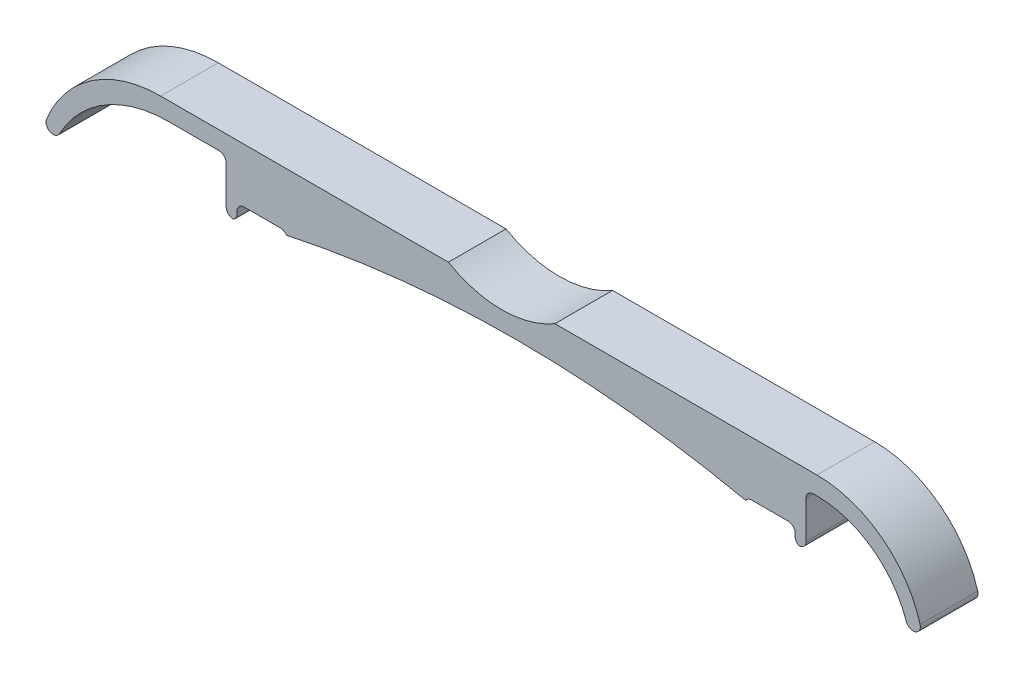
ISO-10303-21;
HEADER;
FILE_DESCRIPTION(('STEP AP214'),'2;1');
FILE_NAME('part.step','',(''),(''),'','','');
FILE_SCHEMA(('AUTOMOTIVE_DESIGN { 1 0 10303 214 1 1 1 1 }'));
ENDSEC;
DATA;
#1=APPLICATION_CONTEXT('core data for automotive mechanical design processes');
#2=APPLICATION_PROTOCOL_DEFINITION('international standard','automotive_design',2000,#1);
#3=PRODUCT_CONTEXT('',#1,'mechanical');
#4=PRODUCT('Part','Part','',(#3));
#5=PRODUCT_RELATED_PRODUCT_CATEGORY('part','',(#4));
#6=PRODUCT_DEFINITION_FORMATION('','',#4);
#7=PRODUCT_DEFINITION_CONTEXT('part definition',#1,'design');
#8=PRODUCT_DEFINITION('design','',#6,#7);
#9=PRODUCT_DEFINITION_SHAPE('','',#8);
#10=(LENGTH_UNIT() NAMED_UNIT(*) SI_UNIT(.MILLI.,.METRE.));
#11=(NAMED_UNIT(*) PLANE_ANGLE_UNIT() SI_UNIT($,.RADIAN.));
#12=(NAMED_UNIT(*) SI_UNIT($,.STERADIAN.) SOLID_ANGLE_UNIT());
#13=UNCERTAINTY_MEASURE_WITH_UNIT(LENGTH_MEASURE(1.E-05),#10,'distance_accuracy_value','');
#14=(GEOMETRIC_REPRESENTATION_CONTEXT(3) GLOBAL_UNCERTAINTY_ASSIGNED_CONTEXT((#13)) GLOBAL_UNIT_ASSIGNED_CONTEXT((#10,
#11,#12)) REPRESENTATION_CONTEXT('',''));
#15=CARTESIAN_POINT('',(0.,0.,0.));
#16=DIRECTION('',(0.,0.,1.));
#17=DIRECTION('',(1.,0.,0.));
#18=AXIS2_PLACEMENT_3D('',#15,#16,#17);
#19=CARTESIAN_POINT('',(34.8072451704714,-1.32210817021467,-8.745));
#20=CARTESIAN_POINT('',(34.8072451704714,-1.32210817021467,-8.48000000000014));
#21=CARTESIAN_POINT('',(34.8072451704711,-1.32210817021364,-8.21499999999981));
#22=CARTESIAN_POINT('',(34.8072451704711,-1.32210817021364,-5.30000000000195));
#23=CARTESIAN_POINT('',(34.8072451704711,-1.32210817021364,-2.64999999999852));
#24=CARTESIAN_POINT('',(34.8072451704711,-1.32210817021364,0.264999999999852));
#25=CARTESIAN_POINT('',(34.8072451704714,-1.32210817021467,0.530000000000103));
#26=CARTESIAN_POINT('',(34.8072451704714,-1.32210817021467,0.794999999999999));
#27=CARTESIAN_POINT('',(35.41903631473,-3.12478184197892,-8.745));
#28=CARTESIAN_POINT('',(35.41903631473,-3.12478184197886,-8.48000000000014));
#29=CARTESIAN_POINT('',(35.4190363147302,-3.12478184198218,-8.21499999999981));
#30=CARTESIAN_POINT('',(35.4190363147302,-3.12478184198155,-5.30000000000195));
#31=CARTESIAN_POINT('',(35.4190363147302,-3.12478184198213,-2.64999999999852));
#32=CARTESIAN_POINT('',(35.4190363147302,-3.12478184198213,0.264999999999852));
#33=CARTESIAN_POINT('',(35.41903631473,-3.12478184197892,0.530000000000103));
#34=CARTESIAN_POINT('',(35.41903631473,-3.12478184197892,0.794999999999999));
#35=CARTESIAN_POINT('',(37.2362025298268,-2.55748322768902,-8.745));
#36=CARTESIAN_POINT('',(37.2362025298268,-2.55748322768896,-8.48000000000015));
#37=CARTESIAN_POINT('',(37.2362025298303,-2.55748322769001,-8.21499999999981));
#38=CARTESIAN_POINT('',(37.2362025298303,-2.55748322768938,-5.30000000000195));
#39=CARTESIAN_POINT('',(37.2362025298303,-2.55748322768995,-2.64999999999852));
#40=CARTESIAN_POINT('',(37.2362025298303,-2.55748322768995,0.264999999999852));
#41=CARTESIAN_POINT('',(37.2362025298268,-2.55748322768902,0.530000000000103));
#42=CARTESIAN_POINT('',(37.2362025298268,-2.55748322768902,0.794999999999999));
#43=CARTESIAN_POINT('',(36.7137392145456,-0.726922424205404,-8.745));
#44=CARTESIAN_POINT('',(36.7137392145456,-0.726922424205404,-8.48000000000014));
#45=CARTESIAN_POINT('',(36.7137392145449,-0.726922424203169,-8.21499999999981));
#46=CARTESIAN_POINT('',(36.7137392145449,-0.726922424203169,-5.30000000000195));
#47=CARTESIAN_POINT('',(36.7137392145449,-0.726922424203169,-2.64999999999852));
#48=CARTESIAN_POINT('',(36.7137392145449,-0.726922424203169,0.264999999999852));
#49=CARTESIAN_POINT('',(36.7137392145456,-0.726922424205404,0.530000000000103));
#50=CARTESIAN_POINT('',(36.7137392145456,-0.726922424205404,0.794999999999999));
#51=(BOUNDED_SURFACE() B_SPLINE_SURFACE(3,3,((#19,#20,#21,#22,#23,#24,#25,#26),(#27,#28,#29,#30,
#31,#32,#33,#34),(#35,#36,#37,#38,#39,#40,#41,#42),(#43,#44,#45,#46,#47,#48,#49,#50)),
.UNSPECIFIED.,.F.,.F.,.F.) B_SPLINE_SURFACE_WITH_KNOTS((4,4),(4,2,2,4),(0.,1.),(-0.1,0.,1.,1.1),
.UNSPECIFIED.) GEOMETRIC_REPRESENTATION_ITEM() RATIONAL_B_SPLINE_SURFACE(((1.,1.,1.,1.,1.,1.,1.,
1.),(0.349719254855024,0.349719254855024,0.349719254854328,0.349719254854328,0.349719254854328,
0.349719254854328,0.349719254855024,0.349719254855024),(0.349719254855024,0.349719254855024,
0.349719254854328,0.349719254854328,0.349719254854328,0.349719254854328,0.349719254855024,
0.349719254855024),(1.,1.,1.,1.,1.,1.,1.,1.))) REPRESENTATION_ITEM('') SURFACE());
#52=CARTESIAN_POINT('',(34.8072451704714,-1.32210817021467,0.794999999999999));
#53=CARTESIAN_POINT('',(34.8072451704714,-1.32210817021467,0.530000000000103));
#54=CARTESIAN_POINT('',(34.8072451704711,-1.32210817021364,0.264999999999852));
#55=CARTESIAN_POINT('',(34.8072451704711,-1.32210817021364,-2.64999999999852));
#56=CARTESIAN_POINT('',(34.8072451704711,-1.32210817021364,-5.30000000000195));
#57=CARTESIAN_POINT('',(34.8072451704711,-1.32210817021364,-8.21499999999981));
#58=CARTESIAN_POINT('',(34.8072451704714,-1.32210817021467,-8.48000000000014));
#59=CARTESIAN_POINT('',(34.8072451704714,-1.32210817021467,-8.745));
#60=(BOUNDED_CURVE() B_SPLINE_CURVE(3,(#52,#53,#54,#55,#56,#57,#58,#59),.UNSPECIFIED.,.F.,
.F.) B_SPLINE_CURVE_WITH_KNOTS((4,2,2,4),(-0.1,0.,1.,1.1),
.UNSPECIFIED.) CURVE() GEOMETRIC_REPRESENTATION_ITEM() RATIONAL_B_SPLINE_CURVE((1.,1.,1.,1.,1.,
1.,1.,1.)) REPRESENTATION_ITEM(''));
#61=CARTESIAN_POINT('',(34.8072451704711,-1.32210817021363,-7.95));
#62=VERTEX_POINT('',#61);
#63=CARTESIAN_POINT('',(34.8072451704711,-1.32210817021363,0.));
#64=VERTEX_POINT('',#63);
#65=EDGE_CURVE('E711',#62,#64,#60,.F.);
#66=CARTESIAN_POINT('',(34.8072451704711,-1.32210817021364,-7.95));
#67=CARTESIAN_POINT('',(35.4190363147302,-3.12478184198213,-7.95));
#68=CARTESIAN_POINT('',(37.2362025298303,-2.55748322768995,-7.95));
#69=CARTESIAN_POINT('',(36.7137392145449,-0.726922424203169,-7.95));
#70=(BOUNDED_CURVE() B_SPLINE_CURVE(3,(#66,#67,#68,#69),.UNSPECIFIED.,.F.,
.F.) B_SPLINE_CURVE_WITH_KNOTS((4,4),(0.,1.),
.UNSPECIFIED.) CURVE() GEOMETRIC_REPRESENTATION_ITEM() RATIONAL_B_SPLINE_CURVE((1.,
0.349719254854328,0.349719254854328,1.)) REPRESENTATION_ITEM(''));
#71=CARTESIAN_POINT('',(36.7137392145449,-0.726922424203171,-7.95));
#72=VERTEX_POINT('',#71);
#73=EDGE_CURVE('E55',#72,#62,#70,.F.);
#74=CARTESIAN_POINT('',(36.7137392145456,-0.726922424205404,-8.745));
#75=CARTESIAN_POINT('',(36.7137392145456,-0.726922424205404,-8.48000000000014));
#76=CARTESIAN_POINT('',(36.7137392145449,-0.726922424203169,-8.21499999999981));
#77=CARTESIAN_POINT('',(36.7137392145449,-0.726922424203169,-5.30000000000195));
#78=CARTESIAN_POINT('',(36.7137392145449,-0.726922424203169,-2.64999999999852));
#79=CARTESIAN_POINT('',(36.7137392145449,-0.726922424203169,0.264999999999852));
#80=CARTESIAN_POINT('',(36.7137392145456,-0.726922424205404,0.530000000000103));
#81=CARTESIAN_POINT('',(36.7137392145456,-0.726922424205404,0.794999999999999));
#82=(BOUNDED_CURVE() B_SPLINE_CURVE(3,(#74,#75,#76,#77,#78,#79,#80,#81),.UNSPECIFIED.,.F.,
.F.) B_SPLINE_CURVE_WITH_KNOTS((4,2,2,4),(-0.1,0.,1.,1.1),
.UNSPECIFIED.) CURVE() GEOMETRIC_REPRESENTATION_ITEM() RATIONAL_B_SPLINE_CURVE((1.,1.,1.,1.,1.,
1.,1.,1.)) REPRESENTATION_ITEM(''));
#83=CARTESIAN_POINT('',(36.7137392145449,-0.726922424203171,0.));
#84=VERTEX_POINT('',#83);
#85=EDGE_CURVE('E714',#84,#72,#82,.F.);
#86=CARTESIAN_POINT('',(36.7137392145449,-0.726922424203169,0.));
#87=CARTESIAN_POINT('',(37.2362025298303,-2.55748322768995,0.));
#88=CARTESIAN_POINT('',(35.4190363147302,-3.12478184198213,0.));
#89=CARTESIAN_POINT('',(34.8072451704711,-1.32210817021364,0.));
#90=(BOUNDED_CURVE() B_SPLINE_CURVE(3,(#86,#87,#88,#89),.UNSPECIFIED.,.F.,
.F.) B_SPLINE_CURVE_WITH_KNOTS((4,4),(0.,1.),
.UNSPECIFIED.) CURVE() GEOMETRIC_REPRESENTATION_ITEM() RATIONAL_B_SPLINE_CURVE((1.,
0.349719254854328,0.349719254854328,1.)) REPRESENTATION_ITEM(''));
#91=EDGE_CURVE('E11',#64,#84,#90,.F.);
#92=ORIENTED_EDGE('',*,*,#65,.F.);
#93=ORIENTED_EDGE('',*,*,#73,.F.);
#94=ORIENTED_EDGE('',*,*,#85,.F.);
#95=ORIENTED_EDGE('',*,*,#91,.F.);
#96=EDGE_LOOP('',(#92,#93,#94,#95));
#97=FACE_BOUND('',#96,.T.);
#98=ADVANCED_FACE('F41',(#97),#51,.T.);
#99=CARTESIAN_POINT('',(-83.7810083665044,-0.643067450817734,-8.745));
#100=CARTESIAN_POINT('',(-83.7810083665044,-0.643067450817734,-8.48000000000014));
#101=CARTESIAN_POINT('',(-83.7810083665044,-0.643067450817712,-8.21499999999981));
#102=CARTESIAN_POINT('',(-83.7810083665044,-0.643067450817712,-5.30000000000195));
#103=CARTESIAN_POINT('',(-83.7810083665044,-0.643067450817712,-2.64999999999852));
#104=CARTESIAN_POINT('',(-83.7810083665044,-0.643067450817712,0.264999999999852));
#105=CARTESIAN_POINT('',(-83.7810083665044,-0.643067450817734,0.530000000000103));
#106=CARTESIAN_POINT('',(-83.7810083665044,-0.643067450817734,0.794999999999999));
#107=CARTESIAN_POINT('',(-84.4430526963775,-2.29430865799575,-8.745));
#108=CARTESIAN_POINT('',(-84.4430526963775,-2.29430865799575,-8.48000000000014));
#109=CARTESIAN_POINT('',(-84.4430526963775,-2.29430865799576,-8.21499999999981));
#110=CARTESIAN_POINT('',(-84.4430526963775,-2.29430865799576,-5.30000000000195));
#111=CARTESIAN_POINT('',(-84.4430526963775,-2.29430865799576,-2.64999999999852));
#112=CARTESIAN_POINT('',(-84.4430526963775,-2.29430865799576,0.264999999999852));
#113=CARTESIAN_POINT('',(-84.4430526963775,-2.29430865799575,0.530000000000103));
#114=CARTESIAN_POINT('',(-84.4430526963775,-2.29430865799575,0.794999999999999));
#115=CARTESIAN_POINT('',(-82.8307501980664,-3.04622678714264,-8.745));
#116=CARTESIAN_POINT('',(-82.8307501980664,-3.04622678714264,-8.48000000000014));
#117=CARTESIAN_POINT('',(-82.8307501980664,-3.04622678714268,-8.21499999999981));
#118=CARTESIAN_POINT('',(-82.8307501980664,-3.04622678714268,-5.30000000000195));
#119=CARTESIAN_POINT('',(-82.8307501980664,-3.04622678714268,-2.64999999999852));
#120=CARTESIAN_POINT('',(-82.8307501980664,-3.04622678714268,0.264999999999852));
#121=CARTESIAN_POINT('',(-82.8307501980664,-3.04622678714264,0.530000000000103));
#122=CARTESIAN_POINT('',(-82.8307501980664,-3.04622678714264,0.794999999999999));
#123=CARTESIAN_POINT('',(-81.9912375022438,-1.47775024841069,-8.745));
#124=CARTESIAN_POINT('',(-81.9912375022438,-1.47775024841069,-8.48000000000014));
#125=CARTESIAN_POINT('',(-81.9912375022438,-1.47775024841068,-8.21499999999981));
#126=CARTESIAN_POINT('',(-81.9912375022438,-1.47775024841068,-5.30000000000195));
#127=CARTESIAN_POINT('',(-81.9912375022438,-1.47775024841068,-2.64999999999852));
#128=CARTESIAN_POINT('',(-81.9912375022438,-1.47775024841068,0.264999999999852));
#129=CARTESIAN_POINT('',(-81.9912375022438,-1.47775024841069,0.530000000000103));
#130=CARTESIAN_POINT('',(-81.9912375022438,-1.47775024841069,0.794999999999999));
#131=(BOUNDED_SURFACE() B_SPLINE_SURFACE(3,3,((#99,#100,#101,#102,#103,#104,#105,#106),(#107,
#108,#109,#110,#111,#112,#113,#114),(#115,#116,#117,#118,#119,#120,#121,#122),(#123,#124,#125,
#126,#127,#128,#129,#130)),.UNSPECIFIED.,.F.,.F.,.F.) B_SPLINE_SURFACE_WITH_KNOTS((4,4),(4,2,2,
4),(0.,1.),(-0.1,0.,1.,1.1),
.UNSPECIFIED.) GEOMETRIC_REPRESENTATION_ITEM() RATIONAL_B_SPLINE_SURFACE(((1.,1.,1.,1.,1.,1.,1.,
1.),(0.37002379436352,0.37002379436352,0.370023794363511,0.370023794363511,0.370023794363511,
0.370023794363511,0.37002379436352,0.37002379436352),(0.37002379436352,0.37002379436352,
0.370023794363511,0.370023794363511,0.370023794363511,0.370023794363511,0.37002379436352,
0.37002379436352),(1.,1.,1.,1.,1.,1.,1.,1.))) REPRESENTATION_ITEM('') SURFACE());
#132=CARTESIAN_POINT('',(-81.9912375022438,-1.47775024841069,-8.745));
#133=CARTESIAN_POINT('',(-81.9912375022438,-1.47775024841069,-8.48000000000014));
#134=CARTESIAN_POINT('',(-81.9912375022438,-1.47775024841068,-8.21499999999981));
#135=CARTESIAN_POINT('',(-81.9912375022438,-1.47775024841068,-5.30000000000195));
#136=CARTESIAN_POINT('',(-81.9912375022438,-1.47775024841068,-2.64999999999852));
#137=CARTESIAN_POINT('',(-81.9912375022438,-1.47775024841068,0.264999999999852));
#138=CARTESIAN_POINT('',(-81.9912375022438,-1.47775024841069,0.530000000000103));
#139=CARTESIAN_POINT('',(-81.9912375022438,-1.47775024841069,0.794999999999999));
#140=(BOUNDED_CURVE() B_SPLINE_CURVE(3,(#132,#133,#134,#135,#136,#137,#138,#139),.UNSPECIFIED.,
.F.,.F.) B_SPLINE_CURVE_WITH_KNOTS((4,2,2,4),(-0.1,0.,1.,1.1),
.UNSPECIFIED.) CURVE() GEOMETRIC_REPRESENTATION_ITEM() RATIONAL_B_SPLINE_CURVE((1.,1.,1.,1.,1.,
1.,1.,1.)) REPRESENTATION_ITEM(''));
#141=CARTESIAN_POINT('',(-81.9912375022438,-1.47775024841068,0.));
#142=VERTEX_POINT('',#141);
#143=CARTESIAN_POINT('',(-81.9912375022438,-1.47775024841068,-7.95));
#144=VERTEX_POINT('',#143);
#145=EDGE_CURVE('E351',#142,#144,#140,.F.);
#146=CARTESIAN_POINT('',(-81.9912375022438,-1.47775024841068,0.));
#147=CARTESIAN_POINT('',(-82.8307501980664,-3.04622678714268,0.));
#148=CARTESIAN_POINT('',(-84.4430526963775,-2.29430865799576,0.));
#149=CARTESIAN_POINT('',(-83.7810083665044,-0.643067450817712,0.));
#150=(BOUNDED_CURVE() B_SPLINE_CURVE(3,(#146,#147,#148,#149),.UNSPECIFIED.,.F.,
.F.) B_SPLINE_CURVE_WITH_KNOTS((4,4),(0.,1.),
.UNSPECIFIED.) CURVE() GEOMETRIC_REPRESENTATION_ITEM() RATIONAL_B_SPLINE_CURVE((1.,
0.370023794363511,0.370023794363511,1.)) REPRESENTATION_ITEM(''));
#151=CARTESIAN_POINT('',(-83.7810083665044,-0.643067450817717,0.));
#152=VERTEX_POINT('',#151);
#153=EDGE_CURVE('E717',#152,#142,#150,.F.);
#154=CARTESIAN_POINT('',(-83.7810083665044,-0.643067450817734,0.794999999999999));
#155=CARTESIAN_POINT('',(-83.7810083665044,-0.643067450817734,0.530000000000103));
#156=CARTESIAN_POINT('',(-83.7810083665044,-0.643067450817712,0.264999999999852));
#157=CARTESIAN_POINT('',(-83.7810083665044,-0.643067450817712,-2.64999999999852));
#158=CARTESIAN_POINT('',(-83.7810083665044,-0.643067450817712,-5.30000000000195));
#159=CARTESIAN_POINT('',(-83.7810083665044,-0.643067450817712,-8.21499999999981));
#160=CARTESIAN_POINT('',(-83.7810083665044,-0.643067450817734,-8.48000000000014));
#161=CARTESIAN_POINT('',(-83.7810083665044,-0.643067450817734,-8.745));
#162=(BOUNDED_CURVE() B_SPLINE_CURVE(3,(#154,#155,#156,#157,#158,#159,#160,#161),.UNSPECIFIED.,
.F.,.F.) B_SPLINE_CURVE_WITH_KNOTS((4,2,2,4),(-0.1,0.,1.,1.1),
.UNSPECIFIED.) CURVE() GEOMETRIC_REPRESENTATION_ITEM() RATIONAL_B_SPLINE_CURVE((1.,1.,1.,1.,1.,
1.,1.,1.)) REPRESENTATION_ITEM(''));
#163=CARTESIAN_POINT('',(-83.7810083665044,-0.64306745081771,-7.95));
#164=VERTEX_POINT('',#163);
#165=EDGE_CURVE('E273',#164,#152,#162,.F.);
#166=CARTESIAN_POINT('',(-83.7810083665044,-0.643067450817712,-7.95));
#167=CARTESIAN_POINT('',(-84.4430526963775,-2.29430865799576,-7.95));
#168=CARTESIAN_POINT('',(-82.8307501980664,-3.04622678714268,-7.95));
#169=CARTESIAN_POINT('',(-81.9912375022438,-1.47775024841068,-7.95));
#170=(BOUNDED_CURVE() B_SPLINE_CURVE(3,(#166,#167,#168,#169),.UNSPECIFIED.,.F.,
.F.) B_SPLINE_CURVE_WITH_KNOTS((4,4),(0.,1.),
.UNSPECIFIED.) CURVE() GEOMETRIC_REPRESENTATION_ITEM() RATIONAL_B_SPLINE_CURVE((1.,
0.370023794363511,0.370023794363511,1.)) REPRESENTATION_ITEM(''));
#171=EDGE_CURVE('E393',#144,#164,#170,.F.);
#172=ORIENTED_EDGE('',*,*,#145,.F.);
#173=ORIENTED_EDGE('',*,*,#153,.F.);
#174=ORIENTED_EDGE('',*,*,#165,.F.);
#175=ORIENTED_EDGE('',*,*,#171,.F.);
#176=EDGE_LOOP('',(#172,#173,#174,#175));
#177=FACE_BOUND('',#176,.T.);
#178=ADVANCED_FACE('F358',(#177),#131,.T.);
#179=CARTESIAN_POINT('',(-68.0471613175873,9.99999999999999,-7.95));
#180=DIRECTION('',(0.,1.,0.));
#181=DIRECTION('',(0.,0.,1.));
#182=AXIS2_PLACEMENT_3D('',#179,#180,#181);
#183=PLANE('',#182);
#184=DIRECTION('',(0.,0.,1.));
#185=VECTOR('',#184,1.);
#186=CARTESIAN_POINT('',(-28.3484692283495,9.99999999999998,-7.95));
#187=LINE('',#186,#185);
#188=CARTESIAN_POINT('',(-28.3484692283495,9.99999999999998,-7.95));
#189=VERTEX_POINT('',#188);
#190=CARTESIAN_POINT('',(-28.3484692283495,9.99999999999999,0.));
#191=VERTEX_POINT('',#190);
#192=EDGE_CURVE('E230',#189,#191,#187,.T.);
#193=ORIENTED_EDGE('',*,*,#192,.F.);
#194=DIRECTION('',(-1.,0.,0.));
#195=VECTOR('',#194,1.);
#196=CARTESIAN_POINT('',(0.,9.99999999999999,-7.95));
#197=LINE('',#196,#195);
#198=CARTESIAN_POINT('',(-68.0471613175873,9.99999999999998,-7.95));
#199=VERTEX_POINT('',#198);
#200=EDGE_CURVE('E239',#189,#199,#197,.T.);
#201=ORIENTED_EDGE('',*,*,#200,.T.);
#202=DIRECTION('',(0.,0.,1.));
#203=VECTOR('',#202,1.);
#204=CARTESIAN_POINT('',(-68.0471613175873,9.99999999999998,-7.95));
#205=LINE('',#204,#203);
#206=CARTESIAN_POINT('',(-68.0471613175873,9.99999999999998,0.));
#207=VERTEX_POINT('',#206);
#208=EDGE_CURVE('E545',#199,#207,#205,.T.);
#209=ORIENTED_EDGE('',*,*,#208,.T.);
#210=DIRECTION('',(-1.,0.,0.));
#211=VECTOR('',#210,1.);
#212=CARTESIAN_POINT('',(-68.0471613175873,9.99999999999999,0.));
#213=LINE('',#212,#211);
#214=EDGE_CURVE('E420',#191,#207,#213,.T.);
#215=ORIENTED_EDGE('',*,*,#214,.F.);
#216=EDGE_LOOP('',(#193,#201,#209,#215));
#217=FACE_BOUND('',#216,.T.);
#218=ADVANCED_FACE('F296',(#217),#183,.T.);
#219=CARTESIAN_POINT('',(-19.0031252487569,-144.56832294801,-7.95));
#220=DIRECTION('',(0.,0.,1.));
#221=DIRECTION('',(1.,0.,0.));
#222=AXIS2_PLACEMENT_3D('',#219,#220,#221);
#223=CYLINDRICAL_SURFACE('',#222,150.);
#224=DIRECTION('',(0.,0.,1.));
#225=VECTOR('',#224,1.);
#226=CARTESIAN_POINT('',(-50.6687591272683,2.05121064513673,-3.975));
#227=LINE('',#226,#225);
#228=CARTESIAN_POINT('',(-50.6687591272683,2.05121064513673,-7.95));
#229=VERTEX_POINT('',#228);
#230=CARTESIAN_POINT('',(-50.668759127266,2.05121064513827,0.));
#231=VERTEX_POINT('',#230);
#232=EDGE_CURVE('E446',#229,#231,#227,.T.);
#233=ORIENTED_EDGE('',*,*,#232,.F.);
#234=CARTESIAN_POINT('',(-19.0031252487569,-144.56832294801,-7.95));
#235=DIRECTION('',(0.,0.,-1.));
#236=DIRECTION('',(-1.,0.,0.));
#237=AXIS2_PLACEMENT_3D('',#234,#235,#236);
#238=CIRCLE('',#237,150.);
#239=CARTESIAN_POINT('',(12.6625086297545,2.05121064513673,-7.95));
#240=VERTEX_POINT('',#239);
#241=EDGE_CURVE('E438',#229,#240,#238,.T.);
#242=ORIENTED_EDGE('',*,*,#241,.T.);
#243=DIRECTION('',(0.,0.,1.));
#244=VECTOR('',#243,1.);
#245=CARTESIAN_POINT('',(12.6625086297545,2.05121064513673,-3.975));
#246=LINE('',#245,#244);
#247=CARTESIAN_POINT('',(12.6625086297545,2.05121064513673,0.));
#248=VERTEX_POINT('',#247);
#249=EDGE_CURVE('E450',#248,#240,#246,.F.);
#250=ORIENTED_EDGE('',*,*,#249,.F.);
#251=CARTESIAN_POINT('',(-19.0031252487569,-144.56832294801,0.));
#252=DIRECTION('',(0.,0.,-1.));
#253=DIRECTION('',(-1.,0.,0.));
#254=AXIS2_PLACEMENT_3D('',#251,#252,#253);
#255=CIRCLE('',#254,150.);
#256=EDGE_CURVE('E449',#231,#248,#255,.T.);
#257=ORIENTED_EDGE('',*,*,#256,.F.);
#258=EDGE_LOOP('',(#233,#242,#250,#257));
#259=FACE_BOUND('',#258,.T.);
#260=ADVANCED_FACE('F679',(#259),#223,.F.);
#261=CARTESIAN_POINT('',(-59.0031252487569,0.,-7.95));
#262=DIRECTION('',(-1.,0.,0.));
#263=DIRECTION('',(0.,0.,1.));
#264=AXIS2_PLACEMENT_3D('',#261,#262,#263);
#265=PLANE('',#264);
#266=DIRECTION('',(0.,-1.,0.));
#267=VECTOR('',#266,1.);
#268=CARTESIAN_POINT('',(-59.0031252487569,0.,-7.95));
#269=LINE('',#268,#267);
#270=CARTESIAN_POINT('',(-59.0031252487569,6.49999999999998,-7.95));
#271=VERTEX_POINT('',#270);
#272=CARTESIAN_POINT('',(-59.0031252487569,1.30833728247415,-7.95));
#273=VERTEX_POINT('',#272);
#274=EDGE_CURVE('E554',#271,#273,#269,.T.);
#275=ORIENTED_EDGE('',*,*,#274,.T.);
#276=DIRECTION('',(0.,0.,1.));
#277=VECTOR('',#276,1.);
#278=CARTESIAN_POINT('',(-59.0031252487569,1.30833728247415,-7.95));
#279=LINE('',#278,#277);
#280=CARTESIAN_POINT('',(-59.0031252487569,1.30833728247415,0.));
#281=VERTEX_POINT('',#280);
#282=EDGE_CURVE('E607',#273,#281,#279,.T.);
#283=ORIENTED_EDGE('',*,*,#282,.T.);
#284=DIRECTION('',(0.,-1.,0.));
#285=VECTOR('',#284,1.);
#286=CARTESIAN_POINT('',(-59.0031252487569,0.,0.));
#287=LINE('',#286,#285);
#288=CARTESIAN_POINT('',(-59.0031252487569,6.49999999999998,0.));
#289=VERTEX_POINT('',#288);
#290=EDGE_CURVE('E445',#289,#281,#287,.T.);
#291=ORIENTED_EDGE('',*,*,#290,.F.);
#292=DIRECTION('',(0.,0.,1.));
#293=VECTOR('',#292,1.);
#294=CARTESIAN_POINT('',(-59.0031252487569,6.49999999999998,-7.95));
#295=LINE('',#294,#293);
#296=EDGE_CURVE('E604',#289,#271,#295,.F.);
#297=ORIENTED_EDGE('',*,*,#296,.T.);
#298=EDGE_LOOP('',(#275,#283,#291,#297));
#299=FACE_BOUND('',#298,.T.);
#300=ADVANCED_FACE('F654',(#299),#265,.T.);
#301=CARTESIAN_POINT('',(-59.0031252487569,7.49999999999998,-7.95));
#302=DIRECTION('',(0.,-1.,0.));
#303=DIRECTION('',(1.,0.,0.));
#304=AXIS2_PLACEMENT_3D('',#301,#302,#303);
#305=PLANE('',#304);
#306=DIRECTION('',(1.,0.,0.));
#307=VECTOR('',#306,1.);
#308=CARTESIAN_POINT('',(-59.0031252487569,7.49999999999998,-7.95));
#309=LINE('',#308,#307);
#310=CARTESIAN_POINT('',(-67.0031252487569,7.49999999999998,-7.95));
#311=VERTEX_POINT('',#310);
#312=CARTESIAN_POINT('',(-60.0031252487569,7.49999999999998,-7.95));
#313=VERTEX_POINT('',#312);
#314=EDGE_CURVE('E630',#311,#313,#309,.T.);
#315=ORIENTED_EDGE('',*,*,#314,.T.);
#316=DIRECTION('',(0.,0.,1.));
#317=VECTOR('',#316,1.);
#318=CARTESIAN_POINT('',(-60.0031252487569,7.49999999999998,0.));
#319=LINE('',#318,#317);
#320=CARTESIAN_POINT('',(-60.0031252487569,7.49999999999998,0.));
#321=VERTEX_POINT('',#320);
#322=EDGE_CURVE('E610',#313,#321,#319,.T.);
#323=ORIENTED_EDGE('',*,*,#322,.T.);
#324=DIRECTION('',(1.,0.,0.));
#325=VECTOR('',#324,1.);
#326=CARTESIAN_POINT('',(-59.0031252487569,7.49999999999998,0.));
#327=LINE('',#326,#325);
#328=CARTESIAN_POINT('',(-67.0031252487569,7.49999999999998,0.));
#329=VERTEX_POINT('',#328);
#330=EDGE_CURVE('E529',#329,#321,#327,.T.);
#331=ORIENTED_EDGE('',*,*,#330,.F.);
#332=DIRECTION('',(0.,0.,1.));
#333=VECTOR('',#332,1.);
#334=CARTESIAN_POINT('',(-67.0031252487569,7.49999999999998,-7.95));
#335=LINE('',#334,#333);
#336=EDGE_CURVE('E540',#311,#329,#335,.T.);
#337=ORIENTED_EDGE('',*,*,#336,.F.);
#338=EDGE_LOOP('',(#315,#323,#331,#337));
#339=FACE_BOUND('',#338,.T.);
#340=ADVANCED_FACE('F787',(#339),#305,.T.);
#341=CARTESIAN_POINT('',(-67.0031252487569,-9.50000000000002,-7.95));
#342=DIRECTION('',(0.,0.,1.));
#343=DIRECTION('',(1.,0.,0.));
#344=AXIS2_PLACEMENT_3D('',#341,#342,#343);
#345=CYLINDRICAL_SURFACE('',#344,17.);
#346=CARTESIAN_POINT('',(-67.0031252487569,-9.50000000000002,0.));
#347=DIRECTION('',(0.,0.,-1.));
#348=DIRECTION('',(1.,0.,0.));
#349=AXIS2_PLACEMENT_3D('',#346,#347,#348);
#350=CIRCLE('',#349,17.);
#351=EDGE_CURVE('E527',#142,#329,#350,.T.);
#352=ORIENTED_EDGE('',*,*,#351,.F.);
#353=ORIENTED_EDGE('',*,*,#145,.T.);
#354=CARTESIAN_POINT('',(-67.0031252487569,-9.50000000000002,-7.95));
#355=DIRECTION('',(0.,0.,-1.));
#356=DIRECTION('',(1.,0.,0.));
#357=AXIS2_PLACEMENT_3D('',#354,#355,#356);
#358=CIRCLE('',#357,17.);
#359=EDGE_CURVE('E252',#144,#311,#358,.T.);
#360=ORIENTED_EDGE('',*,*,#359,.T.);
#361=ORIENTED_EDGE('',*,*,#336,.T.);
#362=EDGE_LOOP('',(#352,#353,#360,#361));
#363=FACE_BOUND('',#362,.T.);
#364=ADVANCED_FACE('F290',(#363),#345,.F.);
#365=CARTESIAN_POINT('',(-68.0471613175873,-6.95135492604854,-7.95));
#366=DIRECTION('',(0.,0.,1.));
#367=DIRECTION('',(1.,0.,0.));
#368=AXIS2_PLACEMENT_3D('',#365,#366,#367);
#369=CYLINDRICAL_SURFACE('',#368,16.9513549260485);
#370=CARTESIAN_POINT('',(-68.0471613175873,-6.95135492604854,-7.95));
#371=DIRECTION('',(0.,0.,1.));
#372=DIRECTION('',(1.,0.,0.));
#373=AXIS2_PLACEMENT_3D('',#370,#371,#372);
#374=CIRCLE('',#373,16.9513549260485);
#375=EDGE_CURVE('E247',#199,#164,#374,.T.);
#376=ORIENTED_EDGE('',*,*,#375,.T.);
#377=ORIENTED_EDGE('',*,*,#165,.T.);
#378=CARTESIAN_POINT('',(-68.0471613175873,-6.95135492604854,0.));
#379=DIRECTION('',(0.,0.,1.));
#380=DIRECTION('',(1.,0.,0.));
#381=AXIS2_PLACEMENT_3D('',#378,#379,#380);
#382=CIRCLE('',#381,16.9513549260485);
#383=EDGE_CURVE('E265',#207,#152,#382,.T.);
#384=ORIENTED_EDGE('',*,*,#383,.F.);
#385=ORIENTED_EDGE('',*,*,#208,.F.);
#386=EDGE_LOOP('',(#376,#377,#384,#385));
#387=FACE_BOUND('',#386,.T.);
#388=ADVANCED_FACE('F280',(#387),#369,.T.);
#389=DIRECTION('',(0.,0.,1.));
#390=VECTOR('',#389,1.);
#391=CARTESIAN_POINT('',(-13.6515307716505,9.99999999999998,-7.95));
#392=LINE('',#391,#390);
#393=CARTESIAN_POINT('',(-13.6515307716505,9.99999999999998,-7.95));
#394=VERTEX_POINT('',#393);
#395=CARTESIAN_POINT('',(-13.6515307716505,9.99999999999998,0.));
#396=VERTEX_POINT('',#395);
#397=EDGE_CURVE('E218',#394,#396,#392,.T.);
#398=ORIENTED_EDGE('',*,*,#397,.T.);
#399=CARTESIAN_POINT('',(22.4968747512431,9.99999999999998,0.));
#400=VERTEX_POINT('',#399);
#401=EDGE_CURVE('E416',#400,#396,#213,.T.);
#402=ORIENTED_EDGE('',*,*,#401,.F.);
#403=DIRECTION('',(0.,0.,1.));
#404=VECTOR('',#403,1.);
#405=CARTESIAN_POINT('',(22.4968747512431,9.99999999999998,-7.95));
#406=LINE('',#405,#404);
#407=CARTESIAN_POINT('',(22.4968747512431,9.99999999999998,-7.95));
#408=VERTEX_POINT('',#407);
#409=EDGE_CURVE('E245',#408,#400,#406,.T.);
#410=ORIENTED_EDGE('',*,*,#409,.F.);
#411=EDGE_CURVE('E237',#408,#394,#197,.T.);
#412=ORIENTED_EDGE('',*,*,#411,.T.);
#413=EDGE_LOOP('',(#398,#402,#410,#412));
#414=FACE_BOUND('',#413,.T.);
#415=ADVANCED_FACE('F243',(#414),#183,.T.);
#416=CARTESIAN_POINT('',(22.4968747512431,-4.78458067092485,-7.95));
#417=DIRECTION('',(0.,0.,1.));
#418=DIRECTION('',(1.,0.,0.));
#419=AXIS2_PLACEMENT_3D('',#416,#417,#418);
#420=CYLINDRICAL_SURFACE('',#419,14.7845806709248);
#421=CARTESIAN_POINT('',(22.4968747512431,-4.78458067092485,0.));
#422=DIRECTION('',(0.,0.,1.));
#423=DIRECTION('',(-1.,0.,0.));
#424=AXIS2_PLACEMENT_3D('',#421,#422,#423);
#425=CIRCLE('',#424,14.7845806709248);
#426=EDGE_CURVE('E406',#84,#400,#425,.T.);
#427=ORIENTED_EDGE('',*,*,#426,.F.);
#428=ORIENTED_EDGE('',*,*,#85,.T.);
#429=CARTESIAN_POINT('',(22.4968747512431,-4.78458067092485,-7.95));
#430=DIRECTION('',(0.,0.,1.));
#431=DIRECTION('',(-1.,0.,0.));
#432=AXIS2_PLACEMENT_3D('',#429,#430,#431);
#433=CIRCLE('',#432,14.7845806709248);
#434=EDGE_CURVE('E254',#72,#408,#433,.T.);
#435=ORIENTED_EDGE('',*,*,#434,.T.);
#436=ORIENTED_EDGE('',*,*,#409,.T.);
#437=EDGE_LOOP('',(#427,#428,#435,#436));
#438=FACE_BOUND('',#437,.T.);
#439=ADVANCED_FACE('F295',(#438),#420,.T.);
#440=CARTESIAN_POINT('',(22.4968747512431,-5.50000000000001,-7.95));
#441=DIRECTION('',(0.,0.,1.));
#442=DIRECTION('',(1.,0.,0.));
#443=AXIS2_PLACEMENT_3D('',#440,#441,#442);
#444=CYLINDRICAL_SURFACE('',#443,13.);
#445=CARTESIAN_POINT('',(22.4968747512431,-5.50000000000001,-7.95));
#446=DIRECTION('',(0.,0.,-1.));
#447=DIRECTION('',(-1.,0.,0.));
#448=AXIS2_PLACEMENT_3D('',#445,#446,#447);
#449=CIRCLE('',#448,13.);
#450=CARTESIAN_POINT('',(22.4968747512431,7.49999999999999,-7.95));
#451=VERTEX_POINT('',#450);
#452=EDGE_CURVE('E408',#451,#62,#449,.T.);
#453=ORIENTED_EDGE('',*,*,#452,.T.);
#454=ORIENTED_EDGE('',*,*,#65,.T.);
#455=CARTESIAN_POINT('',(22.4968747512431,-5.50000000000001,0.));
#456=DIRECTION('',(0.,0.,-1.));
#457=DIRECTION('',(-1.,0.,0.));
#458=AXIS2_PLACEMENT_3D('',#455,#456,#457);
#459=CIRCLE('',#458,13.);
#460=CARTESIAN_POINT('',(22.4968747512431,7.49999999999999,0.));
#461=VERTEX_POINT('',#460);
#462=EDGE_CURVE('E397',#461,#64,#459,.T.);
#463=ORIENTED_EDGE('',*,*,#462,.F.);
#464=DIRECTION('',(0.,0.,1.));
#465=VECTOR('',#464,1.);
#466=CARTESIAN_POINT('',(22.4968747512431,7.49999999999999,-7.95));
#467=LINE('',#466,#465);
#468=EDGE_CURVE('E551',#451,#461,#467,.T.);
#469=ORIENTED_EDGE('',*,*,#468,.F.);
#470=EDGE_LOOP('',(#453,#454,#463,#469));
#471=FACE_BOUND('',#470,.T.);
#472=ADVANCED_FACE('F300',(#471),#444,.F.);
#473=CARTESIAN_POINT('',(22.4968747512431,7.49999999999999,-7.95));
#474=DIRECTION('',(0.,-1.,0.));
#475=DIRECTION('',(0.,0.,-1.));
#476=AXIS2_PLACEMENT_3D('',#473,#474,#475);
#477=PLANE('',#476);
#478=DIRECTION('',(1.,0.,0.));
#479=VECTOR('',#478,1.);
#480=CARTESIAN_POINT('',(22.4968747512431,7.49999999999999,0.));
#481=LINE('',#480,#479);
#482=CARTESIAN_POINT('',(21.9968747512431,7.49999999999999,0.));
#483=VERTEX_POINT('',#482);
#484=EDGE_CURVE('E407',#483,#461,#481,.T.);
#485=ORIENTED_EDGE('',*,*,#484,.F.);
#486=DIRECTION('',(0.,0.,1.));
#487=VECTOR('',#486,1.);
#488=CARTESIAN_POINT('',(21.9968747512431,7.49999999999999,-7.95));
#489=LINE('',#488,#487);
#490=CARTESIAN_POINT('',(21.9968747512431,7.49999999999999,-7.95));
#491=VERTEX_POINT('',#490);
#492=EDGE_CURVE('E601',#483,#491,#489,.F.);
#493=ORIENTED_EDGE('',*,*,#492,.T.);
#494=DIRECTION('',(1.,0.,0.));
#495=VECTOR('',#494,1.);
#496=CARTESIAN_POINT('',(22.4968747512431,7.49999999999999,-7.95));
#497=LINE('',#496,#495);
#498=EDGE_CURVE('E426',#491,#451,#497,.T.);
#499=ORIENTED_EDGE('',*,*,#498,.T.);
#500=ORIENTED_EDGE('',*,*,#468,.T.);
#501=EDGE_LOOP('',(#485,#493,#499,#500));
#502=FACE_BOUND('',#501,.T.);
#503=ADVANCED_FACE('F709',(#502),#477,.T.);
#504=CARTESIAN_POINT('',(20.9968747512431,0.,-7.95));
#505=DIRECTION('',(1.,0.,0.));
#506=DIRECTION('',(0.,1.,0.));
#507=AXIS2_PLACEMENT_3D('',#504,#505,#506);
#508=PLANE('',#507);
#509=DIRECTION('',(0.,1.,0.));
#510=VECTOR('',#509,1.);
#511=CARTESIAN_POINT('',(20.9968747512431,0.,0.));
#512=LINE('',#511,#510);
#513=CARTESIAN_POINT('',(20.9968747512431,1.30833728247415,0.));
#514=VERTEX_POINT('',#513);
#515=CARTESIAN_POINT('',(20.9968747512431,6.49999999999999,0.));
#516=VERTEX_POINT('',#515);
#517=EDGE_CURVE('E519',#514,#516,#512,.T.);
#518=ORIENTED_EDGE('',*,*,#517,.F.);
#519=DIRECTION('',(0.,0.,1.));
#520=VECTOR('',#519,1.);
#521=CARTESIAN_POINT('',(20.9968747512431,1.30833728247415,-7.95));
#522=LINE('',#521,#520);
#523=CARTESIAN_POINT('',(20.9968747512431,1.30833728247415,-7.95));
#524=VERTEX_POINT('',#523);
#525=EDGE_CURVE('E598',#514,#524,#522,.F.);
#526=ORIENTED_EDGE('',*,*,#525,.T.);
#527=DIRECTION('',(0.,1.,0.));
#528=VECTOR('',#527,1.);
#529=CARTESIAN_POINT('',(20.9968747512431,0.,-7.95));
#530=LINE('',#529,#528);
#531=CARTESIAN_POINT('',(20.9968747512431,6.49999999999999,-7.95));
#532=VERTEX_POINT('',#531);
#533=EDGE_CURVE('E431',#524,#532,#530,.T.);
#534=ORIENTED_EDGE('',*,*,#533,.T.);
#535=DIRECTION('',(0.,0.,1.));
#536=VECTOR('',#535,1.);
#537=CARTESIAN_POINT('',(20.9968747512431,6.49999999999999,0.));
#538=LINE('',#537,#536);
#539=EDGE_CURVE('E594',#532,#516,#538,.T.);
#540=ORIENTED_EDGE('',*,*,#539,.T.);
#541=EDGE_LOOP('',(#518,#526,#534,#540));
#542=FACE_BOUND('',#541,.T.);
#543=ADVANCED_FACE('F331',(#542),#508,.T.);
#544=CARTESIAN_POINT('',(-19.0031252487569,-144.56832294801,-7.95));
#545=DIRECTION('',(0.,0.,-1.));
#546=DIRECTION('',(-1.,0.,0.));
#547=AXIS2_PLACEMENT_3D('',#544,#545,#546);
#548=PLANE('',#547);
#549=ORIENTED_EDGE('',*,*,#434,.F.);
#550=ORIENTED_EDGE('',*,*,#73,.T.);
#551=ORIENTED_EDGE('',*,*,#452,.F.);
#552=ORIENTED_EDGE('',*,*,#498,.F.);
#553=CARTESIAN_POINT('',(21.9968747512431,6.49999999999999,-7.95));
#554=DIRECTION('',(0.,0.,-1.));
#555=DIRECTION('',(-1.,0.,0.));
#556=AXIS2_PLACEMENT_3D('',#553,#554,#555);
#557=CIRCLE('',#556,1.);
#558=EDGE_CURVE('E617',#491,#532,#557,.F.);
#559=ORIENTED_EDGE('',*,*,#558,.T.);
#560=ORIENTED_EDGE('',*,*,#533,.F.);
#561=CARTESIAN_POINT('',(19.9968747512431,1.30833728247415,-7.95));
#562=DIRECTION('',(0.,0.,-1.));
#563=DIRECTION('',(-1.,0.,0.));
#564=AXIS2_PLACEMENT_3D('',#561,#562,#563);
#565=CIRCLE('',#564,1.);
#566=CARTESIAN_POINT('',(19.9821583021654,0.30844557527454,-7.95));
#567=VERTEX_POINT('',#566);
#568=EDGE_CURVE('E584',#524,#567,#565,.T.);
#569=ORIENTED_EDGE('',*,*,#568,.T.);
#570=CARTESIAN_POINT('',(20.4712211628424,1.18069411686482,-7.95));
#571=DIRECTION('',(0.,0.,-1.));
#572=DIRECTION('',(-1.,0.,0.));
#573=AXIS2_PLACEMENT_3D('',#570,#571,#572);
#574=CIRCLE('',#573,1.);
#575=CARTESIAN_POINT('',(19.4840479570427,1.3403470584324,-7.95));
#576=VERTEX_POINT('',#575);
#577=EDGE_CURVE('E587',#567,#576,#574,.T.);
#578=ORIENTED_EDGE('',*,*,#577,.T.);
#579=CARTESIAN_POINT('',(18.4968747512431,1.49999999999998,-7.95));
#580=DIRECTION('',(0.,0.,1.));
#581=DIRECTION('',(1.,0.,0.));
#582=AXIS2_PLACEMENT_3D('',#579,#580,#581);
#583=CIRCLE('',#582,1.);
#584=CARTESIAN_POINT('',(18.4968747512431,2.49999999999998,-7.95));
#585=VERTEX_POINT('',#584);
#586=EDGE_CURVE('E475',#576,#585,#583,.T.);
#587=ORIENTED_EDGE('',*,*,#586,.T.);
#588=DIRECTION('',(-1.,0.,0.));
#589=VECTOR('',#588,1.);
#590=CARTESIAN_POINT('',(13.4968747512431,2.49999999999998,-7.95));
#591=LINE('',#590,#589);
#592=CARTESIAN_POINT('',(13.4968747512431,2.49999999999998,-7.95));
#593=VERTEX_POINT('',#592);
#594=EDGE_CURVE('E459',#585,#593,#591,.T.);
#595=ORIENTED_EDGE('',*,*,#594,.T.);
#596=CARTESIAN_POINT('',(13.4968747512431,1.49999999999998,-7.95));
#597=DIRECTION('',(0.,0.,1.));
#598=DIRECTION('',(1.,0.,0.));
#599=AXIS2_PLACEMENT_3D('',#596,#597,#598);
#600=CIRCLE('',#599,1.);
#601=EDGE_CURVE('E467',#593,#240,#600,.T.);
#602=ORIENTED_EDGE('',*,*,#601,.T.);
#603=ORIENTED_EDGE('',*,*,#241,.F.);
#604=CARTESIAN_POINT('',(-51.5031252487569,1.49999999999998,-7.95));
#605=DIRECTION('',(0.,0.,1.));
#606=DIRECTION('',(1.,0.,0.));
#607=AXIS2_PLACEMENT_3D('',#604,#605,#606);
#608=CIRCLE('',#607,0.999999999999999);
#609=CARTESIAN_POINT('',(-51.5031252487569,2.49999999999998,-7.95));
#610=VERTEX_POINT('',#609);
#611=EDGE_CURVE('E499',#229,#610,#608,.T.);
#612=ORIENTED_EDGE('',*,*,#611,.T.);
#613=DIRECTION('',(-1.,0.,0.));
#614=VECTOR('',#613,1.);
#615=CARTESIAN_POINT('',(-56.5031252487569,2.49999999999997,-7.95));
#616=LINE('',#615,#614);
#617=CARTESIAN_POINT('',(-56.5031252487569,2.49999999999997,-7.95));
#618=VERTEX_POINT('',#617);
#619=EDGE_CURVE('E485',#610,#618,#616,.T.);
#620=ORIENTED_EDGE('',*,*,#619,.T.);
#621=CARTESIAN_POINT('',(-56.5031252487569,1.49999999999998,-7.95));
#622=DIRECTION('',(0.,0.,1.));
#623=DIRECTION('',(1.,0.,0.));
#624=AXIS2_PLACEMENT_3D('',#621,#622,#623);
#625=CIRCLE('',#624,0.999999999999999);
#626=CARTESIAN_POINT('',(-57.4902984545566,1.3403470584324,-7.95));
#627=VERTEX_POINT('',#626);
#628=EDGE_CURVE('E492',#618,#627,#625,.T.);
#629=ORIENTED_EDGE('',*,*,#628,.T.);
#630=CARTESIAN_POINT('',(-58.4774716603563,1.18069411686482,-7.95));
#631=DIRECTION('',(0.,0.,-1.));
#632=DIRECTION('',(-1.,0.,0.));
#633=AXIS2_PLACEMENT_3D('',#630,#631,#632);
#634=CIRCLE('',#633,1.);
#635=CARTESIAN_POINT('',(-57.9884087996792,0.308445575274539,-7.95));
#636=VERTEX_POINT('',#635);
#637=EDGE_CURVE('E581',#627,#636,#634,.T.);
#638=ORIENTED_EDGE('',*,*,#637,.T.);
#639=CARTESIAN_POINT('',(-58.0031252487569,1.30833728247415,-7.95));
#640=DIRECTION('',(0.,0.,-1.));
#641=DIRECTION('',(-1.,0.,0.));
#642=AXIS2_PLACEMENT_3D('',#639,#640,#641);
#643=CIRCLE('',#642,1.);
#644=EDGE_CURVE('E578',#636,#273,#643,.T.);
#645=ORIENTED_EDGE('',*,*,#644,.T.);
#646=ORIENTED_EDGE('',*,*,#274,.F.);
#647=CARTESIAN_POINT('',(-60.0031252487569,6.49999999999998,-7.95));
#648=DIRECTION('',(0.,0.,-1.));
#649=DIRECTION('',(-1.,0.,0.));
#650=AXIS2_PLACEMENT_3D('',#647,#648,#649);
#651=CIRCLE('',#650,1.);
#652=EDGE_CURVE('E623',#271,#313,#651,.F.);
#653=ORIENTED_EDGE('',*,*,#652,.T.);
#654=ORIENTED_EDGE('',*,*,#314,.F.);
#655=ORIENTED_EDGE('',*,*,#359,.F.);
#656=ORIENTED_EDGE('',*,*,#171,.T.);
#657=ORIENTED_EDGE('',*,*,#375,.F.);
#658=ORIENTED_EDGE('',*,*,#200,.F.);
#659=CARTESIAN_POINT('',(-21.,22.5,-7.95));
#660=DIRECTION('',(0.,0.,1.));
#661=DIRECTION('',(1.,0.,0.));
#662=AXIS2_PLACEMENT_3D('',#659,#660,#661);
#663=CIRCLE('',#662,14.5);
#664=EDGE_CURVE('E221',#189,#394,#663,.T.);
#665=ORIENTED_EDGE('',*,*,#664,.T.);
#666=ORIENTED_EDGE('',*,*,#411,.F.);
#667=EDGE_LOOP('',(#549,#550,#551,#552,#559,#560,#569,#578,#587,#595,#602,#603,#612,#620,#629,
#638,#645,#646,#653,#654,#655,#656,#657,#658,#665,#666));
#668=FACE_BOUND('',#667,.T.);
#669=ADVANCED_FACE('F236',(#668),#548,.T.);
#670=CARTESIAN_POINT('',(-19.0031252487569,-144.56832294801,0.));
#671=DIRECTION('',(0.,0.,-1.));
#672=DIRECTION('',(-1.,0.,0.));
#673=AXIS2_PLACEMENT_3D('',#670,#671,#672);
#674=PLANE('',#673);
#675=ORIENTED_EDGE('',*,*,#462,.T.);
#676=ORIENTED_EDGE('',*,*,#91,.T.);
#677=ORIENTED_EDGE('',*,*,#426,.T.);
#678=ORIENTED_EDGE('',*,*,#401,.T.);
#679=CARTESIAN_POINT('',(-21.,22.5,0.));
#680=DIRECTION('',(0.,0.,1.));
#681=DIRECTION('',(1.,0.,0.));
#682=AXIS2_PLACEMENT_3D('',#679,#680,#681);
#683=CIRCLE('',#682,14.5);
#684=EDGE_CURVE('E224',#191,#396,#683,.T.);
#685=ORIENTED_EDGE('',*,*,#684,.F.);
#686=ORIENTED_EDGE('',*,*,#214,.T.);
#687=ORIENTED_EDGE('',*,*,#383,.T.);
#688=ORIENTED_EDGE('',*,*,#153,.T.);
#689=ORIENTED_EDGE('',*,*,#351,.T.);
#690=ORIENTED_EDGE('',*,*,#330,.T.);
#691=CARTESIAN_POINT('',(-60.0031252487569,6.49999999999998,0.));
#692=DIRECTION('',(0.,0.,-1.));
#693=DIRECTION('',(-1.,0.,0.));
#694=AXIS2_PLACEMENT_3D('',#691,#692,#693);
#695=CIRCLE('',#694,1.);
#696=EDGE_CURVE('E620',#321,#289,#695,.T.);
#697=ORIENTED_EDGE('',*,*,#696,.T.);
#698=ORIENTED_EDGE('',*,*,#290,.T.);
#699=CARTESIAN_POINT('',(-58.0031252487569,1.30833728247415,0.));
#700=DIRECTION('',(0.,0.,-1.));
#701=DIRECTION('',(-1.,0.,0.));
#702=AXIS2_PLACEMENT_3D('',#699,#700,#701);
#703=CIRCLE('',#702,1.);
#704=CARTESIAN_POINT('',(-57.9884087996792,0.308445575274539,0.));
#705=VERTEX_POINT('',#704);
#706=EDGE_CURVE('E566',#281,#705,#703,.F.);
#707=ORIENTED_EDGE('',*,*,#706,.T.);
#708=CARTESIAN_POINT('',(-58.4774716603563,1.18069411686482,0.));
#709=DIRECTION('',(0.,0.,-1.));
#710=DIRECTION('',(-1.,0.,0.));
#711=AXIS2_PLACEMENT_3D('',#708,#709,#710);
#712=CIRCLE('',#711,1.);
#713=CARTESIAN_POINT('',(-57.4902984545566,1.3403470584324,0.));
#714=VERTEX_POINT('',#713);
#715=EDGE_CURVE('E569',#705,#714,#712,.F.);
#716=ORIENTED_EDGE('',*,*,#715,.T.);
#717=CARTESIAN_POINT('',(-56.5031252487569,1.49999999999998,0.));
#718=DIRECTION('',(0.,0.,1.));
#719=DIRECTION('',(1.,0.,0.));
#720=AXIS2_PLACEMENT_3D('',#717,#718,#719);
#721=CIRCLE('',#720,0.999999999999999);
#722=CARTESIAN_POINT('',(-56.5031252487569,2.49999999999997,0.));
#723=VERTEX_POINT('',#722);
#724=EDGE_CURVE('E462',#723,#714,#721,.T.);
#725=ORIENTED_EDGE('',*,*,#724,.F.);
#726=DIRECTION('',(-1.,0.,0.));
#727=VECTOR('',#726,1.);
#728=CARTESIAN_POINT('',(-56.5031252487569,2.49999999999997,0.));
#729=LINE('',#728,#727);
#730=CARTESIAN_POINT('',(-51.5031252487569,2.49999999999998,0.));
#731=VERTEX_POINT('',#730);
#732=EDGE_CURVE('E488',#731,#723,#729,.T.);
#733=ORIENTED_EDGE('',*,*,#732,.F.);
#734=CARTESIAN_POINT('',(-51.5031252487569,1.49999999999998,0.));
#735=DIRECTION('',(0.,0.,-1.));
#736=DIRECTION('',(-1.,0.,0.));
#737=AXIS2_PLACEMENT_3D('',#734,#735,#736);
#738=CIRCLE('',#737,0.999999999999999);
#739=EDGE_CURVE('E558',#731,#231,#738,.T.);
#740=ORIENTED_EDGE('',*,*,#739,.T.);
#741=ORIENTED_EDGE('',*,*,#256,.T.);
#742=CARTESIAN_POINT('',(13.4968747512431,1.49999999999998,0.));
#743=DIRECTION('',(0.,0.,1.));
#744=DIRECTION('',(1.,0.,0.));
#745=AXIS2_PLACEMENT_3D('',#742,#743,#744);
#746=CIRCLE('',#745,1.);
#747=CARTESIAN_POINT('',(13.4968747512431,2.49999999999998,0.));
#748=VERTEX_POINT('',#747);
#749=EDGE_CURVE('E468',#748,#248,#746,.T.);
#750=ORIENTED_EDGE('',*,*,#749,.F.);
#751=DIRECTION('',(-1.,0.,0.));
#752=VECTOR('',#751,1.);
#753=CARTESIAN_POINT('',(13.4968747512431,2.49999999999998,0.));
#754=LINE('',#753,#752);
#755=CARTESIAN_POINT('',(18.4968747512431,2.49999999999998,0.));
#756=VERTEX_POINT('',#755);
#757=EDGE_CURVE('E463',#756,#748,#754,.T.);
#758=ORIENTED_EDGE('',*,*,#757,.F.);
#759=CARTESIAN_POINT('',(18.4968747512431,1.49999999999998,0.));
#760=DIRECTION('',(0.,0.,-1.));
#761=DIRECTION('',(-1.,0.,0.));
#762=AXIS2_PLACEMENT_3D('',#759,#760,#761);
#763=CIRCLE('',#762,1.);
#764=CARTESIAN_POINT('',(19.4840479570427,1.3403470584324,0.));
#765=VERTEX_POINT('',#764);
#766=EDGE_CURVE('E544',#756,#765,#763,.T.);
#767=ORIENTED_EDGE('',*,*,#766,.T.);
#768=CARTESIAN_POINT('',(20.4712211628424,1.18069411686482,0.));
#769=DIRECTION('',(0.,0.,-1.));
#770=DIRECTION('',(-1.,0.,0.));
#771=AXIS2_PLACEMENT_3D('',#768,#769,#770);
#772=CIRCLE('',#771,1.);
#773=CARTESIAN_POINT('',(19.9821583021654,0.30844557527454,0.));
#774=VERTEX_POINT('',#773);
#775=EDGE_CURVE('E575',#765,#774,#772,.F.);
#776=ORIENTED_EDGE('',*,*,#775,.T.);
#777=CARTESIAN_POINT('',(19.9968747512431,1.30833728247415,0.));
#778=DIRECTION('',(0.,0.,-1.));
#779=DIRECTION('',(-1.,0.,0.));
#780=AXIS2_PLACEMENT_3D('',#777,#778,#779);
#781=CIRCLE('',#780,1.);
#782=EDGE_CURVE('E572',#774,#514,#781,.F.);
#783=ORIENTED_EDGE('',*,*,#782,.T.);
#784=ORIENTED_EDGE('',*,*,#517,.T.);
#785=CARTESIAN_POINT('',(21.9968747512431,6.49999999999999,0.));
#786=DIRECTION('',(0.,0.,-1.));
#787=DIRECTION('',(-1.,0.,0.));
#788=AXIS2_PLACEMENT_3D('',#785,#786,#787);
#789=CIRCLE('',#788,1.);
#790=EDGE_CURVE('E614',#516,#483,#789,.T.);
#791=ORIENTED_EDGE('',*,*,#790,.T.);
#792=ORIENTED_EDGE('',*,*,#484,.T.);
#793=EDGE_LOOP('',(#675,#676,#677,#678,#685,#686,#687,#688,#689,#690,#697,#698,#707,#716,#725,
#733,#740,#741,#750,#758,#767,#776,#783,#784,#791,#792));
#794=FACE_BOUND('',#793,.T.);
#795=ADVANCED_FACE('F330',(#794),#674,.F.);
#796=CARTESIAN_POINT('',(13.4968747512431,1.49999999999998,-7.95));
#797=DIRECTION('',(0.,0.,1.));
#798=DIRECTION('',(1.,0.,0.));
#799=AXIS2_PLACEMENT_3D('',#796,#797,#798);
#800=CYLINDRICAL_SURFACE('',#799,1.);
#801=ORIENTED_EDGE('',*,*,#249,.T.);
#802=ORIENTED_EDGE('',*,*,#601,.F.);
#803=DIRECTION('',(0.,0.,1.));
#804=VECTOR('',#803,1.);
#805=CARTESIAN_POINT('',(13.4968747512431,2.49999999999998,-7.95));
#806=LINE('',#805,#804);
#807=EDGE_CURVE('E458',#593,#748,#806,.T.);
#808=ORIENTED_EDGE('',*,*,#807,.T.);
#809=ORIENTED_EDGE('',*,*,#749,.T.);
#810=EDGE_LOOP('',(#801,#802,#808,#809));
#811=FACE_BOUND('',#810,.T.);
#812=ADVANCED_FACE('F332',(#811),#800,.F.);
#813=CARTESIAN_POINT('',(13.4968747512431,2.49999999999998,-7.95));
#814=DIRECTION('',(0.,1.,0.));
#815=DIRECTION('',(-1.,0.,0.));
#816=AXIS2_PLACEMENT_3D('',#813,#814,#815);
#817=PLANE('',#816);
#818=ORIENTED_EDGE('',*,*,#757,.T.);
#819=ORIENTED_EDGE('',*,*,#807,.F.);
#820=ORIENTED_EDGE('',*,*,#594,.F.);
#821=DIRECTION('',(0.,0.,1.));
#822=VECTOR('',#821,1.);
#823=CARTESIAN_POINT('',(18.4968747512431,2.49999999999998,-7.95));
#824=LINE('',#823,#822);
#825=EDGE_CURVE('E454',#585,#756,#824,.T.);
#826=ORIENTED_EDGE('',*,*,#825,.T.);
#827=EDGE_LOOP('',(#818,#819,#820,#826));
#828=FACE_BOUND('',#827,.T.);
#829=ADVANCED_FACE('F686',(#828),#817,.F.);
#830=CARTESIAN_POINT('',(18.4968747512431,1.49999999999998,-7.95));
#831=DIRECTION('',(0.,0.,1.));
#832=DIRECTION('',(1.,0.,0.));
#833=AXIS2_PLACEMENT_3D('',#830,#831,#832);
#834=CYLINDRICAL_SURFACE('',#833,1.);
#835=ORIENTED_EDGE('',*,*,#586,.F.);
#836=DIRECTION('',(0.,0.,1.));
#837=VECTOR('',#836,1.);
#838=CARTESIAN_POINT('',(19.4840479570427,1.3403470584324,-7.95));
#839=LINE('',#838,#837);
#840=EDGE_CURVE('E562',#576,#765,#839,.T.);
#841=ORIENTED_EDGE('',*,*,#840,.T.);
#842=ORIENTED_EDGE('',*,*,#766,.F.);
#843=ORIENTED_EDGE('',*,*,#825,.F.);
#844=EDGE_LOOP('',(#835,#841,#842,#843));
#845=FACE_BOUND('',#844,.T.);
#846=ADVANCED_FACE('F690',(#845),#834,.F.);
#847=CARTESIAN_POINT('',(-56.5031252487569,1.49999999999998,-7.95));
#848=DIRECTION('',(0.,0.,1.));
#849=DIRECTION('',(1.,0.,0.));
#850=AXIS2_PLACEMENT_3D('',#847,#848,#849);
#851=CYLINDRICAL_SURFACE('',#850,0.999999999999999);
#852=ORIENTED_EDGE('',*,*,#724,.T.);
#853=DIRECTION('',(0.,0.,1.));
#854=VECTOR('',#853,1.);
#855=CARTESIAN_POINT('',(-57.4902984545566,1.3403470584324,-7.95));
#856=LINE('',#855,#854);
#857=EDGE_CURVE('E590',#714,#627,#856,.F.);
#858=ORIENTED_EDGE('',*,*,#857,.T.);
#859=ORIENTED_EDGE('',*,*,#628,.F.);
#860=DIRECTION('',(0.,0.,1.));
#861=VECTOR('',#860,1.);
#862=CARTESIAN_POINT('',(-56.5031252487569,2.49999999999997,-7.95));
#863=LINE('',#862,#861);
#864=EDGE_CURVE('E453',#618,#723,#863,.T.);
#865=ORIENTED_EDGE('',*,*,#864,.T.);
#866=EDGE_LOOP('',(#852,#858,#859,#865));
#867=FACE_BOUND('',#866,.T.);
#868=ADVANCED_FACE('F666',(#867),#851,.F.);
#869=CARTESIAN_POINT('',(-56.5031252487569,2.49999999999997,-7.95));
#870=DIRECTION('',(0.,1.,0.));
#871=DIRECTION('',(-1.,0.,0.));
#872=AXIS2_PLACEMENT_3D('',#869,#870,#871);
#873=PLANE('',#872);
#874=ORIENTED_EDGE('',*,*,#732,.T.);
#875=ORIENTED_EDGE('',*,*,#864,.F.);
#876=ORIENTED_EDGE('',*,*,#619,.F.);
#877=DIRECTION('',(0.,0.,1.));
#878=VECTOR('',#877,1.);
#879=CARTESIAN_POINT('',(-51.5031252487569,2.49999999999998,-7.95));
#880=LINE('',#879,#878);
#881=EDGE_CURVE('E481',#610,#731,#880,.T.);
#882=ORIENTED_EDGE('',*,*,#881,.T.);
#883=EDGE_LOOP('',(#874,#875,#876,#882));
#884=FACE_BOUND('',#883,.T.);
#885=ADVANCED_FACE('F672',(#884),#873,.F.);
#886=CARTESIAN_POINT('',(-51.5031252487569,1.49999999999998,-7.95));
#887=DIRECTION('',(0.,0.,1.));
#888=DIRECTION('',(1.,0.,0.));
#889=AXIS2_PLACEMENT_3D('',#886,#887,#888);
#890=CYLINDRICAL_SURFACE('',#889,0.999999999999999);
#891=ORIENTED_EDGE('',*,*,#232,.T.);
#892=ORIENTED_EDGE('',*,*,#739,.F.);
#893=ORIENTED_EDGE('',*,*,#881,.F.);
#894=ORIENTED_EDGE('',*,*,#611,.F.);
#895=EDGE_LOOP('',(#891,#892,#893,#894));
#896=FACE_BOUND('',#895,.T.);
#897=ADVANCED_FACE('F859',(#896),#890,.F.);
#898=CARTESIAN_POINT('',(19.9968747512431,1.30833728247415,-7.95));
#899=DIRECTION('',(0.,0.,1.));
#900=DIRECTION('',(1.,0.,0.));
#901=AXIS2_PLACEMENT_3D('',#898,#899,#900);
#902=CYLINDRICAL_SURFACE('',#901,1.);
#903=DIRECTION('',(0.,0.,1.));
#904=VECTOR('',#903,1.);
#905=CARTESIAN_POINT('',(19.9821583021654,0.308445575274541,-3.975));
#906=LINE('',#905,#904);
#907=EDGE_CURVE('E471',#567,#774,#906,.T.);
#908=ORIENTED_EDGE('',*,*,#907,.F.);
#909=ORIENTED_EDGE('',*,*,#568,.F.);
#910=ORIENTED_EDGE('',*,*,#525,.F.);
#911=ORIENTED_EDGE('',*,*,#782,.F.);
#912=EDGE_LOOP('',(#908,#909,#910,#911));
#913=FACE_BOUND('',#912,.T.);
#914=ADVANCED_FACE('F698',(#913),#902,.T.);
#915=CARTESIAN_POINT('',(20.4712211628424,1.18069411686482,-7.95));
#916=DIRECTION('',(0.,0.,1.));
#917=DIRECTION('',(1.,0.,0.));
#918=AXIS2_PLACEMENT_3D('',#915,#916,#917);
#919=CYLINDRICAL_SURFACE('',#918,1.);
#920=ORIENTED_EDGE('',*,*,#577,.F.);
#921=ORIENTED_EDGE('',*,*,#907,.T.);
#922=ORIENTED_EDGE('',*,*,#775,.F.);
#923=ORIENTED_EDGE('',*,*,#840,.F.);
#924=EDGE_LOOP('',(#920,#921,#922,#923));
#925=FACE_BOUND('',#924,.T.);
#926=ADVANCED_FACE('F694',(#925),#919,.T.);
#927=CARTESIAN_POINT('',(-58.0031252487569,1.30833728247415,-7.95));
#928=DIRECTION('',(0.,0.,1.));
#929=DIRECTION('',(1.,0.,0.));
#930=AXIS2_PLACEMENT_3D('',#927,#928,#929);
#931=CYLINDRICAL_SURFACE('',#930,1.);
#932=DIRECTION('',(0.,0.,1.));
#933=VECTOR('',#932,1.);
#934=CARTESIAN_POINT('',(-57.9884087996792,0.308445575274541,-3.975));
#935=LINE('',#934,#933);
#936=EDGE_CURVE('E508',#705,#636,#935,.F.);
#937=ORIENTED_EDGE('',*,*,#936,.F.);
#938=ORIENTED_EDGE('',*,*,#706,.F.);
#939=ORIENTED_EDGE('',*,*,#282,.F.);
#940=ORIENTED_EDGE('',*,*,#644,.F.);
#941=EDGE_LOOP('',(#937,#938,#939,#940));
#942=FACE_BOUND('',#941,.T.);
#943=ADVANCED_FACE('F659',(#942),#931,.T.);
#944=CARTESIAN_POINT('',(-58.4774716603563,1.18069411686482,-7.95));
#945=DIRECTION('',(0.,0.,-1.));
#946=DIRECTION('',(-1.,0.,0.));
#947=AXIS2_PLACEMENT_3D('',#944,#945,#946);
#948=CYLINDRICAL_SURFACE('',#947,1.);
#949=ORIENTED_EDGE('',*,*,#715,.F.);
#950=ORIENTED_EDGE('',*,*,#936,.T.);
#951=ORIENTED_EDGE('',*,*,#637,.F.);
#952=ORIENTED_EDGE('',*,*,#857,.F.);
#953=EDGE_LOOP('',(#949,#950,#951,#952));
#954=FACE_BOUND('',#953,.T.);
#955=ADVANCED_FACE('F668',(#954),#948,.T.);
#956=CARTESIAN_POINT('',(21.9968747512431,6.49999999999999,-7.95));
#957=DIRECTION('',(0.,0.,-1.));
#958=DIRECTION('',(-1.,0.,0.));
#959=AXIS2_PLACEMENT_3D('',#956,#957,#958);
#960=CYLINDRICAL_SURFACE('',#959,1.);
#961=ORIENTED_EDGE('',*,*,#558,.F.);
#962=ORIENTED_EDGE('',*,*,#492,.F.);
#963=ORIENTED_EDGE('',*,*,#790,.F.);
#964=ORIENTED_EDGE('',*,*,#539,.F.);
#965=EDGE_LOOP('',(#961,#962,#963,#964));
#966=FACE_BOUND('',#965,.T.);
#967=ADVANCED_FACE('F706',(#966),#960,.F.);
#968=CARTESIAN_POINT('',(-60.0031252487569,6.49999999999998,-7.95));
#969=DIRECTION('',(0.,0.,-1.));
#970=DIRECTION('',(-1.,0.,0.));
#971=AXIS2_PLACEMENT_3D('',#968,#969,#970);
#972=CYLINDRICAL_SURFACE('',#971,1.);
#973=ORIENTED_EDGE('',*,*,#652,.F.);
#974=ORIENTED_EDGE('',*,*,#296,.F.);
#975=ORIENTED_EDGE('',*,*,#696,.F.);
#976=ORIENTED_EDGE('',*,*,#322,.F.);
#977=EDGE_LOOP('',(#973,#974,#975,#976));
#978=FACE_BOUND('',#977,.T.);
#979=ADVANCED_FACE('F370',(#978),#972,.F.);
#980=CARTESIAN_POINT('',(-21.,22.5,-7.95));
#981=DIRECTION('',(0.,0.,1.));
#982=DIRECTION('',(1.,0.,0.));
#983=AXIS2_PLACEMENT_3D('',#980,#981,#982);
#984=CYLINDRICAL_SURFACE('',#983,14.5);
#985=ORIENTED_EDGE('',*,*,#684,.T.);
#986=ORIENTED_EDGE('',*,*,#397,.F.);
#987=ORIENTED_EDGE('',*,*,#664,.F.);
#988=ORIENTED_EDGE('',*,*,#192,.T.);
#989=EDGE_LOOP('',(#985,#986,#987,#988));
#990=FACE_BOUND('',#989,.T.);
#991=ADVANCED_FACE('F220',(#990),#984,.F.);
#992=CLOSED_SHELL('',(#98,#178,#218,#260,#300,#340,#364,#388,#415,#439,#472,#503,#543,#669,#795,
#812,#829,#846,#868,#885,#897,#914,#926,#943,#955,#967,#979,#991));
#993=MANIFOLD_SOLID_BREP('B2',#992);
#994=ADVANCED_BREP_SHAPE_REPRESENTATION('',(#18,#993),#14);
#995=SHAPE_DEFINITION_REPRESENTATION(#9,#994);
ENDSEC;
END-ISO-10303-21;
